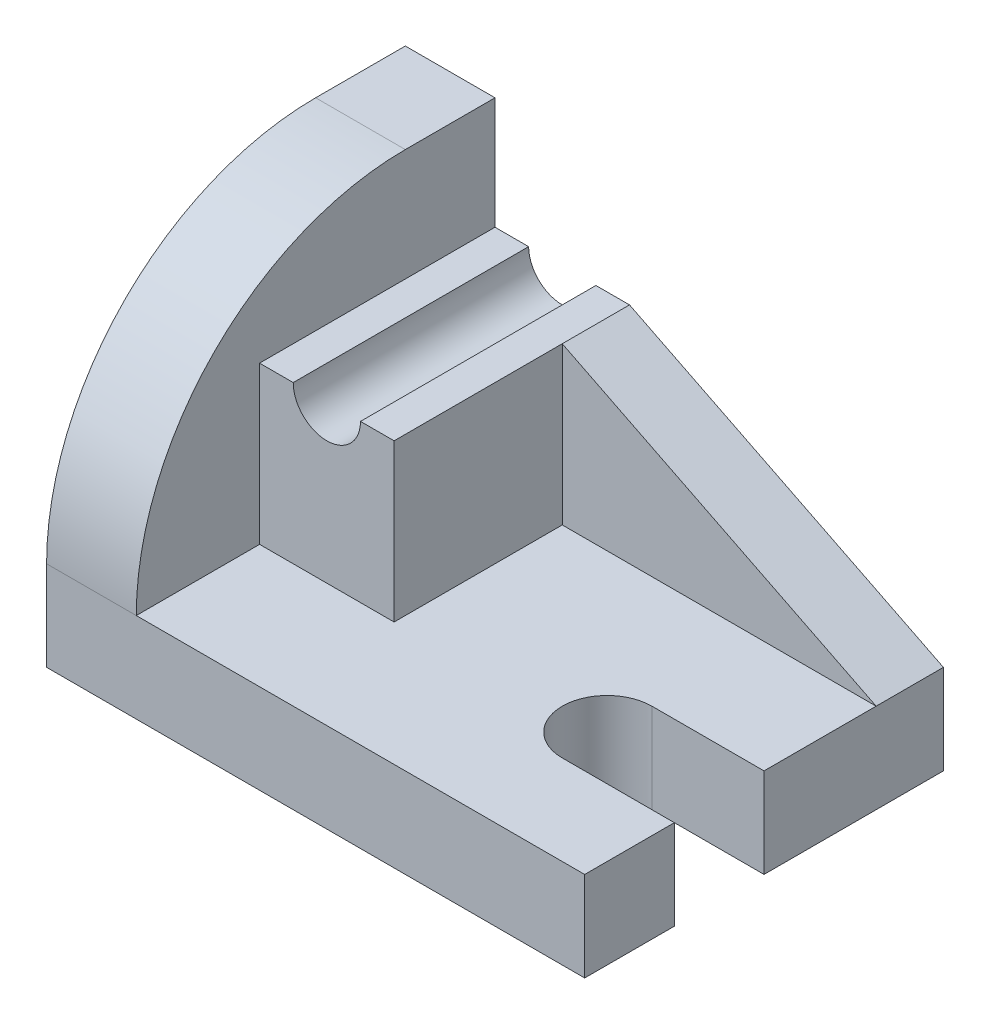
ISO-10303-21;
HEADER;
FILE_DESCRIPTION(('STEP AP214'),'2;1');
FILE_NAME('part.step','',(''),(''),'','','');
FILE_SCHEMA(('AUTOMOTIVE_DESIGN { 1 0 10303 214 1 1 1 1 }'));
ENDSEC;
DATA;
#1=APPLICATION_CONTEXT('core data for automotive mechanical design processes');
#2=APPLICATION_PROTOCOL_DEFINITION('international standard','automotive_design',2000,#1);
#3=PRODUCT_CONTEXT('',#1,'mechanical');
#4=PRODUCT('Part','Part','',(#3));
#5=PRODUCT_RELATED_PRODUCT_CATEGORY('part','',(#4));
#6=PRODUCT_DEFINITION_FORMATION('','',#4);
#7=PRODUCT_DEFINITION_CONTEXT('part definition',#1,'design');
#8=PRODUCT_DEFINITION('design','',#6,#7);
#9=PRODUCT_DEFINITION_SHAPE('','',#8);
#10=(LENGTH_UNIT() NAMED_UNIT(*) SI_UNIT(.MILLI.,.METRE.));
#11=(NAMED_UNIT(*) PLANE_ANGLE_UNIT() SI_UNIT($,.RADIAN.));
#12=(NAMED_UNIT(*) SI_UNIT($,.STERADIAN.) SOLID_ANGLE_UNIT());
#13=UNCERTAINTY_MEASURE_WITH_UNIT(LENGTH_MEASURE(1.E-05),#10,'distance_accuracy_value','');
#14=(GEOMETRIC_REPRESENTATION_CONTEXT(3) GLOBAL_UNCERTAINTY_ASSIGNED_CONTEXT((#13)) GLOBAL_UNIT_ASSIGNED_CONTEXT((#10,
#11,#12)) REPRESENTATION_CONTEXT('',''));
#15=CARTESIAN_POINT('',(0.,0.,0.));
#16=DIRECTION('',(0.,0.,1.));
#17=DIRECTION('',(1.,0.,0.));
#18=AXIS2_PLACEMENT_3D('',#15,#16,#17);
#19=CARTESIAN_POINT('',(0.,44.,0.));
#20=DIRECTION('',(0.,1.,0.));
#21=DIRECTION('',(0.,0.,1.));
#22=AXIS2_PLACEMENT_3D('',#19,#20,#21);
#23=PLANE('',#22);
#24=DIRECTION('',(0.,0.,-1.));
#25=VECTOR('',#24,1.);
#26=CARTESIAN_POINT('',(-14.,44.,10.));
#27=LINE('',#26,#25);
#28=CARTESIAN_POINT('',(-14.,44.,10.));
#29=VERTEX_POINT('',#28);
#30=CARTESIAN_POINT('',(-14.,44.,-32.));
#31=VERTEX_POINT('',#30);
#32=EDGE_CURVE('E11',#29,#31,#27,.T.);
#33=ORIENTED_EDGE('',*,*,#32,.F.);
#34=DIRECTION('',(1.,0.,0.));
#35=VECTOR('',#34,1.);
#36=CARTESIAN_POINT('',(-32.,44.,10.));
#37=LINE('',#36,#35);
#38=CARTESIAN_POINT('',(-7.99999999999999,44.,10.));
#39=VERTEX_POINT('',#38);
#40=EDGE_CURVE('E268',#29,#39,#37,.T.);
#41=ORIENTED_EDGE('',*,*,#40,.T.);
#42=DIRECTION('',(0.,0.,-1.));
#43=VECTOR('',#42,1.);
#44=CARTESIAN_POINT('',(-7.99999999999999,44.,-32.));
#45=LINE('',#44,#43);
#46=CARTESIAN_POINT('',(-7.99999999999999,44.,-20.));
#47=VERTEX_POINT('',#46);
#48=EDGE_CURVE('E174',#39,#47,#45,.T.);
#49=ORIENTED_EDGE('',*,*,#48,.T.);
#50=DIRECTION('',(0.,0.,-1.));
#51=VECTOR('',#50,1.);
#52=CARTESIAN_POINT('',(-7.99999999999999,44.,-20.));
#53=LINE('',#52,#51);
#54=CARTESIAN_POINT('',(-7.99999999999999,44.,-32.));
#55=VERTEX_POINT('',#54);
#56=EDGE_CURVE('E168',#47,#55,#53,.T.);
#57=ORIENTED_EDGE('',*,*,#56,.T.);
#58=DIRECTION('',(-1.,0.,0.));
#59=VECTOR('',#58,1.);
#60=CARTESIAN_POINT('',(-32.,44.,-32.));
#61=LINE('',#60,#59);
#62=EDGE_CURVE('E163',#55,#31,#61,.T.);
#63=ORIENTED_EDGE('',*,*,#62,.T.);
#64=EDGE_LOOP('',(#33,#41,#49,#57,#63));
#65=FACE_BOUND('',#64,.T.);
#66=ADVANCED_FACE('F39',(#65),#23,.T.);
#67=CARTESIAN_POINT('',(0.,16.,0.));
#68=DIRECTION('',(0.,-1.,0.));
#69=DIRECTION('',(0.,0.,-1.));
#70=AXIS2_PLACEMENT_3D('',#67,#68,#69);
#71=PLANE('',#70);
#72=DIRECTION('',(-1.,0.,0.));
#73=VECTOR('',#72,1.);
#74=CARTESIAN_POINT('',(-7.99999999999999,16.,-20.));
#75=LINE('',#74,#73);
#76=CARTESIAN_POINT('',(48.,16.,-20.));
#77=VERTEX_POINT('',#76);
#78=CARTESIAN_POINT('',(-7.99999999999999,16.,-20.));
#79=VERTEX_POINT('',#78);
#80=EDGE_CURVE('E279',#77,#79,#75,.T.);
#81=ORIENTED_EDGE('',*,*,#80,.T.);
#82=DIRECTION('',(0.,0.,-1.));
#83=VECTOR('',#82,1.);
#84=CARTESIAN_POINT('',(-7.99999999999999,16.,-32.));
#85=LINE('',#84,#83);
#86=CARTESIAN_POINT('',(-7.99999999999999,16.,10.));
#87=VERTEX_POINT('',#86);
#88=EDGE_CURVE('E180',#87,#79,#85,.T.);
#89=ORIENTED_EDGE('',*,*,#88,.F.);
#90=DIRECTION('',(1.,0.,0.));
#91=VECTOR('',#90,1.);
#92=CARTESIAN_POINT('',(-32.,16.,10.));
#93=LINE('',#92,#91);
#94=CARTESIAN_POINT('',(-32.,16.,10.));
#95=VERTEX_POINT('',#94);
#96=EDGE_CURVE('E178',#95,#87,#93,.T.);
#97=ORIENTED_EDGE('',*,*,#96,.F.);
#98=DIRECTION('',(0.,0.,-1.));
#99=VECTOR('',#98,1.);
#100=CARTESIAN_POINT('',(-32.,16.,0.));
#101=LINE('',#100,#99);
#102=CARTESIAN_POINT('',(-32.,16.,32.));
#103=VERTEX_POINT('',#102);
#104=EDGE_CURVE('E204',#103,#95,#101,.T.);
#105=ORIENTED_EDGE('',*,*,#104,.F.);
#106=DIRECTION('',(1.,0.,0.));
#107=VECTOR('',#106,1.);
#108=CARTESIAN_POINT('',(-48.,16.,32.));
#109=LINE('',#108,#107);
#110=CARTESIAN_POINT('',(48.,16.,32.));
#111=VERTEX_POINT('',#110);
#112=EDGE_CURVE('E238',#103,#111,#109,.T.);
#113=ORIENTED_EDGE('',*,*,#112,.T.);
#114=DIRECTION('',(0.,0.,-1.));
#115=VECTOR('',#114,1.);
#116=CARTESIAN_POINT('',(48.,16.,32.));
#117=LINE('',#116,#115);
#118=CARTESIAN_POINT('',(48.,16.,16.));
#119=VERTEX_POINT('',#118);
#120=EDGE_CURVE('E235',#111,#119,#117,.T.);
#121=ORIENTED_EDGE('',*,*,#120,.T.);
#122=DIRECTION('',(1.,0.,0.));
#123=VECTOR('',#122,1.);
#124=CARTESIAN_POINT('',(48.,16.,16.));
#125=LINE('',#124,#123);
#126=CARTESIAN_POINT('',(28.,16.,16.));
#127=VERTEX_POINT('',#126);
#128=EDGE_CURVE('E213',#127,#119,#125,.T.);
#129=ORIENTED_EDGE('',*,*,#128,.F.);
#130=CARTESIAN_POINT('',(28.,16.,8.));
#131=DIRECTION('',(0.,1.,0.));
#132=DIRECTION('',(0.,0.,1.));
#133=AXIS2_PLACEMENT_3D('',#130,#131,#132);
#134=CIRCLE('',#133,8.);
#135=CARTESIAN_POINT('',(28.,16.,0.));
#136=VERTEX_POINT('',#135);
#137=EDGE_CURVE('E222',#136,#127,#134,.T.);
#138=ORIENTED_EDGE('',*,*,#137,.F.);
#139=DIRECTION('',(-1.,0.,0.));
#140=VECTOR('',#139,1.);
#141=CARTESIAN_POINT('',(48.,16.,0.));
#142=LINE('',#141,#140);
#143=CARTESIAN_POINT('',(48.,16.,0.));
#144=VERTEX_POINT('',#143);
#145=EDGE_CURVE('E208',#144,#136,#142,.T.);
#146=ORIENTED_EDGE('',*,*,#145,.F.);
#147=EDGE_CURVE('E239',#144,#77,#117,.T.);
#148=ORIENTED_EDGE('',*,*,#147,.T.);
#149=EDGE_LOOP('',(#81,#89,#97,#105,#113,#121,#129,#138,#146,#148));
#150=FACE_BOUND('',#149,.T.);
#151=ADVANCED_FACE('F289',(#150),#71,.F.);
#152=CARTESIAN_POINT('',(-7.99999999999999,44.,-32.));
#153=DIRECTION('',(-1.,0.,0.));
#154=DIRECTION('',(0.,0.,1.));
#155=AXIS2_PLACEMENT_3D('',#152,#153,#154);
#156=PLANE('',#155);
#157=DIRECTION('',(0.,1.,0.));
#158=VECTOR('',#157,1.);
#159=CARTESIAN_POINT('',(-7.99999999999999,44.,-20.));
#160=LINE('',#159,#158);
#161=EDGE_CURVE('E282',#79,#47,#160,.T.);
#162=ORIENTED_EDGE('',*,*,#161,.T.);
#163=ORIENTED_EDGE('',*,*,#48,.F.);
#164=DIRECTION('',(0.,-1.,0.));
#165=VECTOR('',#164,1.);
#166=CARTESIAN_POINT('',(-7.99999999999999,44.,10.));
#167=LINE('',#166,#165);
#168=EDGE_CURVE('E169',#39,#87,#167,.T.);
#169=ORIENTED_EDGE('',*,*,#168,.T.);
#170=ORIENTED_EDGE('',*,*,#88,.T.);
#171=EDGE_LOOP('',(#162,#163,#169,#170));
#172=FACE_BOUND('',#171,.T.);
#173=ADVANCED_FACE('F296',(#172),#156,.F.);
#174=CARTESIAN_POINT('',(-32.,16.,-16.));
#175=DIRECTION('',(-1.,0.,0.));
#176=DIRECTION('',(0.,0.,1.));
#177=AXIS2_PLACEMENT_3D('',#174,#175,#176);
#178=PLANE('',#177);
#179=DIRECTION('',(0.,-1.,0.));
#180=VECTOR('',#179,1.);
#181=CARTESIAN_POINT('',(-32.,44.,10.));
#182=LINE('',#181,#180);
#183=CARTESIAN_POINT('',(-32.,44.,10.));
#184=VERTEX_POINT('',#183);
#185=EDGE_CURVE('E172',#184,#95,#182,.T.);
#186=ORIENTED_EDGE('',*,*,#185,.F.);
#187=DIRECTION('',(0.,0.,1.));
#188=VECTOR('',#187,1.);
#189=CARTESIAN_POINT('',(-32.,44.,-32.));
#190=LINE('',#189,#188);
#191=CARTESIAN_POINT('',(-32.,44.,-32.));
#192=VERTEX_POINT('',#191);
#193=EDGE_CURVE('E183',#192,#184,#190,.T.);
#194=ORIENTED_EDGE('',*,*,#193,.F.);
#195=DIRECTION('',(0.,-1.,0.));
#196=VECTOR('',#195,1.);
#197=CARTESIAN_POINT('',(-32.,0.,-32.));
#198=LINE('',#197,#196);
#199=CARTESIAN_POINT('',(-32.,64.,-32.));
#200=VERTEX_POINT('',#199);
#201=EDGE_CURVE('E194',#200,#192,#198,.T.);
#202=ORIENTED_EDGE('',*,*,#201,.F.);
#203=DIRECTION('',(0.,0.,-1.));
#204=VECTOR('',#203,1.);
#205=CARTESIAN_POINT('',(-32.,64.,-16.0000000000003));
#206=LINE('',#205,#204);
#207=CARTESIAN_POINT('',(-32.,64.,-16.0000000000003));
#208=VERTEX_POINT('',#207);
#209=EDGE_CURVE('E190',#208,#200,#206,.T.);
#210=ORIENTED_EDGE('',*,*,#209,.F.);
#211=CARTESIAN_POINT('',(-32.,16.,-16.));
#212=DIRECTION('',(-1.,0.,0.));
#213=DIRECTION('',(0.,0.,1.));
#214=AXIS2_PLACEMENT_3D('',#211,#212,#213);
#215=CIRCLE('',#214,48.);
#216=EDGE_CURVE('E187',#103,#208,#215,.T.);
#217=ORIENTED_EDGE('',*,*,#216,.F.);
#218=ORIENTED_EDGE('',*,*,#104,.T.);
#219=EDGE_LOOP('',(#186,#194,#202,#210,#217,#218));
#220=FACE_BOUND('',#219,.T.);
#221=ADVANCED_FACE('F301',(#220),#178,.F.);
#222=CARTESIAN_POINT('',(48.,16.,32.));
#223=DIRECTION('',(-1.,0.,0.));
#224=DIRECTION('',(0.,0.,1.));
#225=AXIS2_PLACEMENT_3D('',#222,#223,#224);
#226=PLANE('',#225);
#227=DIRECTION('',(0.,0.,-1.));
#228=VECTOR('',#227,1.);
#229=CARTESIAN_POINT('',(48.,0.,32.));
#230=LINE('',#229,#228);
#231=CARTESIAN_POINT('',(48.,0.,32.));
#232=VERTEX_POINT('',#231);
#233=CARTESIAN_POINT('',(48.,0.,16.));
#234=VERTEX_POINT('',#233);
#235=EDGE_CURVE('E244',#232,#234,#230,.T.);
#236=ORIENTED_EDGE('',*,*,#235,.T.);
#237=DIRECTION('',(0.,1.,0.));
#238=VECTOR('',#237,1.);
#239=CARTESIAN_POINT('',(48.,0.,16.));
#240=LINE('',#239,#238);
#241=EDGE_CURVE('E226',#234,#119,#240,.T.);
#242=ORIENTED_EDGE('',*,*,#241,.T.);
#243=ORIENTED_EDGE('',*,*,#120,.F.);
#244=DIRECTION('',(0.,-1.,0.));
#245=VECTOR('',#244,1.);
#246=CARTESIAN_POINT('',(48.,16.,32.));
#247=LINE('',#246,#245);
#248=EDGE_CURVE('E243',#111,#232,#247,.T.);
#249=ORIENTED_EDGE('',*,*,#248,.T.);
#250=EDGE_LOOP('',(#236,#242,#243,#249));
#251=FACE_BOUND('',#250,.T.);
#252=ADVANCED_FACE('F323',(#251),#226,.F.);
#253=ORIENTED_EDGE('',*,*,#147,.F.);
#254=DIRECTION('',(0.,1.,0.));
#255=VECTOR('',#254,1.);
#256=CARTESIAN_POINT('',(48.,0.,0.));
#257=LINE('',#256,#255);
#258=CARTESIAN_POINT('',(48.,0.,0.));
#259=VERTEX_POINT('',#258);
#260=EDGE_CURVE('E219',#259,#144,#257,.T.);
#261=ORIENTED_EDGE('',*,*,#260,.F.);
#262=CARTESIAN_POINT('',(48.,0.,-32.));
#263=VERTEX_POINT('',#262);
#264=EDGE_CURVE('E229',#259,#263,#230,.T.);
#265=ORIENTED_EDGE('',*,*,#264,.T.);
#266=DIRECTION('',(0.,-1.,0.));
#267=VECTOR('',#266,1.);
#268=CARTESIAN_POINT('',(48.,16.,-32.));
#269=LINE('',#268,#267);
#270=CARTESIAN_POINT('',(48.,16.,-32.));
#271=VERTEX_POINT('',#270);
#272=EDGE_CURVE('E261',#271,#263,#269,.T.);
#273=ORIENTED_EDGE('',*,*,#272,.F.);
#274=DIRECTION('',(0.,0.,-1.));
#275=VECTOR('',#274,1.);
#276=CARTESIAN_POINT('',(48.,16.,-20.));
#277=LINE('',#276,#275);
#278=EDGE_CURVE('E181',#77,#271,#277,.T.);
#279=ORIENTED_EDGE('',*,*,#278,.F.);
#280=EDGE_LOOP('',(#253,#261,#265,#273,#279));
#281=FACE_BOUND('',#280,.T.);
#282=ADVANCED_FACE('F41',(#281),#226,.F.);
#283=CARTESIAN_POINT('',(-48.,16.,-32.));
#284=DIRECTION('',(0.,0.,1.));
#285=DIRECTION('',(1.,0.,0.));
#286=AXIS2_PLACEMENT_3D('',#283,#284,#285);
#287=PLANE('',#286);
#288=CARTESIAN_POINT('',(-26.,44.,-32.));
#289=VERTEX_POINT('',#288);
#290=EDGE_CURVE('E60',#289,#192,#61,.T.);
#291=ORIENTED_EDGE('',*,*,#290,.F.);
#292=CARTESIAN_POINT('',(-20.,44.,-32.));
#293=DIRECTION('',(0.,0.,-1.));
#294=DIRECTION('',(-1.,0.,0.));
#295=AXIS2_PLACEMENT_3D('',#292,#293,#294);
#296=CIRCLE('',#295,6.);
#297=EDGE_CURVE('E53',#31,#289,#296,.T.);
#298=ORIENTED_EDGE('',*,*,#297,.F.);
#299=ORIENTED_EDGE('',*,*,#62,.F.);
#300=DIRECTION('',(0.894427190999916,-0.447213595499958,0.));
#301=VECTOR('',#300,1.);
#302=CARTESIAN_POINT('',(48.,16.,-32.));
#303=LINE('',#302,#301);
#304=EDGE_CURVE('E269',#55,#271,#303,.T.);
#305=ORIENTED_EDGE('',*,*,#304,.T.);
#306=ORIENTED_EDGE('',*,*,#272,.T.);
#307=DIRECTION('',(-1.,0.,0.));
#308=VECTOR('',#307,1.);
#309=CARTESIAN_POINT('',(-48.,0.,-32.));
#310=LINE('',#309,#308);
#311=CARTESIAN_POINT('',(-48.,0.,-32.));
#312=VERTEX_POINT('',#311);
#313=EDGE_CURVE('E247',#263,#312,#310,.T.);
#314=ORIENTED_EDGE('',*,*,#313,.T.);
#315=DIRECTION('',(0.,-1.,0.));
#316=VECTOR('',#315,1.);
#317=CARTESIAN_POINT('',(-48.,16.,-32.));
#318=LINE('',#317,#316);
#319=CARTESIAN_POINT('',(-48.,64.,-32.));
#320=VERTEX_POINT('',#319);
#321=EDGE_CURVE('E258',#320,#312,#318,.T.);
#322=ORIENTED_EDGE('',*,*,#321,.F.);
#323=DIRECTION('',(-1.,0.,0.));
#324=VECTOR('',#323,1.);
#325=CARTESIAN_POINT('',(-32.,64.,-32.));
#326=LINE('',#325,#324);
#327=EDGE_CURVE('E201',#200,#320,#326,.T.);
#328=ORIENTED_EDGE('',*,*,#327,.F.);
#329=ORIENTED_EDGE('',*,*,#201,.T.);
#330=EDGE_LOOP('',(#291,#298,#299,#305,#306,#314,#322,#328,#329));
#331=FACE_BOUND('',#330,.T.);
#332=ADVANCED_FACE('F161',(#331),#287,.F.);
#333=CARTESIAN_POINT('',(-48.,16.,32.));
#334=DIRECTION('',(1.,0.,0.));
#335=DIRECTION('',(0.,0.,-1.));
#336=AXIS2_PLACEMENT_3D('',#333,#334,#335);
#337=PLANE('',#336);
#338=DIRECTION('',(0.,0.,1.));
#339=VECTOR('',#338,1.);
#340=CARTESIAN_POINT('',(-48.,0.,32.));
#341=LINE('',#340,#339);
#342=CARTESIAN_POINT('',(-48.,0.,32.));
#343=VERTEX_POINT('',#342);
#344=EDGE_CURVE('E249',#312,#343,#341,.T.);
#345=ORIENTED_EDGE('',*,*,#344,.T.);
#346=DIRECTION('',(0.,-1.,0.));
#347=VECTOR('',#346,1.);
#348=CARTESIAN_POINT('',(-48.,16.,32.));
#349=LINE('',#348,#347);
#350=CARTESIAN_POINT('',(-48.,15.9999999999997,32.));
#351=VERTEX_POINT('',#350);
#352=EDGE_CURVE('E255',#351,#343,#349,.T.);
#353=ORIENTED_EDGE('',*,*,#352,.F.);
#354=CARTESIAN_POINT('',(-48.,16.,-16.));
#355=DIRECTION('',(-1.,0.,0.));
#356=DIRECTION('',(0.,0.,1.));
#357=AXIS2_PLACEMENT_3D('',#354,#355,#356);
#358=CIRCLE('',#357,48.);
#359=CARTESIAN_POINT('',(-48.,64.,-16.0000000000003));
#360=VERTEX_POINT('',#359);
#361=EDGE_CURVE('E186',#351,#360,#358,.T.);
#362=ORIENTED_EDGE('',*,*,#361,.T.);
#363=DIRECTION('',(0.,0.,-1.));
#364=VECTOR('',#363,1.);
#365=CARTESIAN_POINT('',(-48.,64.,-16.0000000000003));
#366=LINE('',#365,#364);
#367=EDGE_CURVE('E191',#360,#320,#366,.T.);
#368=ORIENTED_EDGE('',*,*,#367,.T.);
#369=ORIENTED_EDGE('',*,*,#321,.T.);
#370=EDGE_LOOP('',(#345,#353,#362,#368,#369));
#371=FACE_BOUND('',#370,.T.);
#372=ADVANCED_FACE('F314',(#371),#337,.F.);
#373=CARTESIAN_POINT('',(-48.,16.,32.));
#374=DIRECTION('',(0.,0.,-1.));
#375=DIRECTION('',(-1.,0.,0.));
#376=AXIS2_PLACEMENT_3D('',#373,#374,#375);
#377=PLANE('',#376);
#378=DIRECTION('',(1.,0.,0.));
#379=VECTOR('',#378,1.);
#380=CARTESIAN_POINT('',(-48.,0.,32.));
#381=LINE('',#380,#379);
#382=EDGE_CURVE('E251',#343,#232,#381,.T.);
#383=ORIENTED_EDGE('',*,*,#382,.T.);
#384=ORIENTED_EDGE('',*,*,#248,.F.);
#385=ORIENTED_EDGE('',*,*,#112,.F.);
#386=EDGE_CURVE('E240',#351,#103,#109,.T.);
#387=ORIENTED_EDGE('',*,*,#386,.F.);
#388=ORIENTED_EDGE('',*,*,#352,.T.);
#389=EDGE_LOOP('',(#383,#384,#385,#387,#388));
#390=FACE_BOUND('',#389,.T.);
#391=ADVANCED_FACE('F310',(#390),#377,.F.);
#392=CARTESIAN_POINT('',(0.,0.,0.));
#393=DIRECTION('',(0.,-1.,0.));
#394=DIRECTION('',(0.,0.,-1.));
#395=AXIS2_PLACEMENT_3D('',#392,#393,#394);
#396=PLANE('',#395);
#397=ORIENTED_EDGE('',*,*,#344,.F.);
#398=ORIENTED_EDGE('',*,*,#313,.F.);
#399=ORIENTED_EDGE('',*,*,#264,.F.);
#400=DIRECTION('',(-1.,0.,0.));
#401=VECTOR('',#400,1.);
#402=CARTESIAN_POINT('',(48.,0.,0.));
#403=LINE('',#402,#401);
#404=CARTESIAN_POINT('',(28.,0.,0.));
#405=VERTEX_POINT('',#404);
#406=EDGE_CURVE('E209',#259,#405,#403,.T.);
#407=ORIENTED_EDGE('',*,*,#406,.T.);
#408=CARTESIAN_POINT('',(28.,0.,8.));
#409=DIRECTION('',(0.,1.,0.));
#410=DIRECTION('',(0.,0.,1.));
#411=AXIS2_PLACEMENT_3D('',#408,#409,#410);
#412=CIRCLE('',#411,8.);
#413=CARTESIAN_POINT('',(28.,0.,16.));
#414=VERTEX_POINT('',#413);
#415=EDGE_CURVE('E212',#405,#414,#412,.T.);
#416=ORIENTED_EDGE('',*,*,#415,.T.);
#417=DIRECTION('',(1.,0.,0.));
#418=VECTOR('',#417,1.);
#419=CARTESIAN_POINT('',(48.,0.,16.));
#420=LINE('',#419,#418);
#421=EDGE_CURVE('E216',#414,#234,#420,.T.);
#422=ORIENTED_EDGE('',*,*,#421,.T.);
#423=ORIENTED_EDGE('',*,*,#235,.F.);
#424=ORIENTED_EDGE('',*,*,#382,.F.);
#425=EDGE_LOOP('',(#397,#398,#399,#407,#416,#422,#423,#424));
#426=FACE_BOUND('',#425,.T.);
#427=ADVANCED_FACE('F318',(#426),#396,.T.);
#428=CARTESIAN_POINT('',(48.,0.,16.));
#429=DIRECTION('',(0.,0.,1.));
#430=DIRECTION('',(1.,0.,0.));
#431=AXIS2_PLACEMENT_3D('',#428,#429,#430);
#432=PLANE('',#431);
#433=ORIENTED_EDGE('',*,*,#128,.T.);
#434=ORIENTED_EDGE('',*,*,#241,.F.);
#435=ORIENTED_EDGE('',*,*,#421,.F.);
#436=DIRECTION('',(0.,1.,0.));
#437=VECTOR('',#436,1.);
#438=CARTESIAN_POINT('',(28.,0.,16.));
#439=LINE('',#438,#437);
#440=EDGE_CURVE('E230',#414,#127,#439,.T.);
#441=ORIENTED_EDGE('',*,*,#440,.T.);
#442=EDGE_LOOP('',(#433,#434,#435,#441));
#443=FACE_BOUND('',#442,.T.);
#444=ADVANCED_FACE('F327',(#443),#432,.F.);
#445=CARTESIAN_POINT('',(28.,0.,8.));
#446=DIRECTION('',(0.,1.,0.));
#447=DIRECTION('',(0.,0.,1.));
#448=AXIS2_PLACEMENT_3D('',#445,#446,#447);
#449=CYLINDRICAL_SURFACE('',#448,8.);
#450=ORIENTED_EDGE('',*,*,#137,.T.);
#451=ORIENTED_EDGE('',*,*,#440,.F.);
#452=ORIENTED_EDGE('',*,*,#415,.F.);
#453=DIRECTION('',(0.,1.,0.));
#454=VECTOR('',#453,1.);
#455=CARTESIAN_POINT('',(28.,0.,0.));
#456=LINE('',#455,#454);
#457=EDGE_CURVE('E232',#405,#136,#456,.T.);
#458=ORIENTED_EDGE('',*,*,#457,.T.);
#459=EDGE_LOOP('',(#450,#451,#452,#458));
#460=FACE_BOUND('',#459,.T.);
#461=ADVANCED_FACE('F330',(#460),#449,.F.);
#462=CARTESIAN_POINT('',(48.,0.,0.));
#463=DIRECTION('',(0.,0.,-1.));
#464=DIRECTION('',(-1.,0.,0.));
#465=AXIS2_PLACEMENT_3D('',#462,#463,#464);
#466=PLANE('',#465);
#467=ORIENTED_EDGE('',*,*,#145,.T.);
#468=ORIENTED_EDGE('',*,*,#457,.F.);
#469=ORIENTED_EDGE('',*,*,#406,.F.);
#470=ORIENTED_EDGE('',*,*,#260,.T.);
#471=EDGE_LOOP('',(#467,#468,#469,#470));
#472=FACE_BOUND('',#471,.T.);
#473=ADVANCED_FACE('F333',(#472),#466,.F.);
#474=CARTESIAN_POINT('',(-32.,64.,-16.0000000000003));
#475=DIRECTION('',(0.,1.,0.));
#476=DIRECTION('',(0.,0.,1.));
#477=AXIS2_PLACEMENT_3D('',#474,#475,#476);
#478=PLANE('',#477);
#479=ORIENTED_EDGE('',*,*,#367,.F.);
#480=DIRECTION('',(-1.,0.,0.));
#481=VECTOR('',#480,1.);
#482=CARTESIAN_POINT('',(-32.,64.,-16.0000000000003));
#483=LINE('',#482,#481);
#484=EDGE_CURVE('E196',#208,#360,#483,.T.);
#485=ORIENTED_EDGE('',*,*,#484,.F.);
#486=ORIENTED_EDGE('',*,*,#209,.T.);
#487=ORIENTED_EDGE('',*,*,#327,.T.);
#488=EDGE_LOOP('',(#479,#485,#486,#487));
#489=FACE_BOUND('',#488,.T.);
#490=ADVANCED_FACE('F341',(#489),#478,.T.);
#491=CARTESIAN_POINT('',(-32.,16.,-16.));
#492=DIRECTION('',(-1.,0.,0.));
#493=DIRECTION('',(0.,0.,1.));
#494=AXIS2_PLACEMENT_3D('',#491,#492,#493);
#495=CYLINDRICAL_SURFACE('',#494,48.);
#496=ORIENTED_EDGE('',*,*,#361,.F.);
#497=ORIENTED_EDGE('',*,*,#386,.T.);
#498=ORIENTED_EDGE('',*,*,#216,.T.);
#499=ORIENTED_EDGE('',*,*,#484,.T.);
#500=EDGE_LOOP('',(#496,#497,#498,#499));
#501=FACE_BOUND('',#500,.T.);
#502=ADVANCED_FACE('F306',(#501),#495,.T.);
#503=CARTESIAN_POINT('',(-32.,44.,10.));
#504=DIRECTION('',(0.,0.,-1.));
#505=DIRECTION('',(-1.,0.,0.));
#506=AXIS2_PLACEMENT_3D('',#503,#504,#505);
#507=PLANE('',#506);
#508=ORIENTED_EDGE('',*,*,#40,.F.);
#509=CARTESIAN_POINT('',(-20.,44.,10.));
#510=DIRECTION('',(0.,0.,-1.));
#511=DIRECTION('',(-1.,0.,0.));
#512=AXIS2_PLACEMENT_3D('',#509,#510,#511);
#513=CIRCLE('',#512,6.);
#514=CARTESIAN_POINT('',(-26.,44.,10.));
#515=VERTEX_POINT('',#514);
#516=EDGE_CURVE('E155',#29,#515,#513,.T.);
#517=ORIENTED_EDGE('',*,*,#516,.T.);
#518=EDGE_CURVE('E266',#184,#515,#37,.T.);
#519=ORIENTED_EDGE('',*,*,#518,.F.);
#520=ORIENTED_EDGE('',*,*,#185,.T.);
#521=ORIENTED_EDGE('',*,*,#96,.T.);
#522=ORIENTED_EDGE('',*,*,#168,.F.);
#523=EDGE_LOOP('',(#508,#517,#519,#520,#521,#522));
#524=FACE_BOUND('',#523,.T.);
#525=ADVANCED_FACE('F265',(#524),#507,.F.);
#526=DIRECTION('',(0.,0.,-1.));
#527=VECTOR('',#526,1.);
#528=CARTESIAN_POINT('',(-26.,44.,10.));
#529=LINE('',#528,#527);
#530=EDGE_CURVE('E47',#289,#515,#529,.F.);
#531=ORIENTED_EDGE('',*,*,#530,.F.);
#532=ORIENTED_EDGE('',*,*,#290,.T.);
#533=ORIENTED_EDGE('',*,*,#193,.T.);
#534=ORIENTED_EDGE('',*,*,#518,.T.);
#535=EDGE_LOOP('',(#531,#532,#533,#534));
#536=FACE_BOUND('',#535,.T.);
#537=ADVANCED_FACE('F271',(#536),#23,.T.);
#538=CARTESIAN_POINT('',(48.,16.,-20.));
#539=DIRECTION('',(0.447213595499958,0.894427190999916,0.));
#540=DIRECTION('',(-0.894427190999916,0.447213595499958,0.));
#541=AXIS2_PLACEMENT_3D('',#538,#539,#540);
#542=PLANE('',#541);
#543=ORIENTED_EDGE('',*,*,#304,.F.);
#544=ORIENTED_EDGE('',*,*,#56,.F.);
#545=DIRECTION('',(0.894427190999916,-0.447213595499958,0.));
#546=VECTOR('',#545,1.);
#547=CARTESIAN_POINT('',(48.,16.,-20.));
#548=LINE('',#547,#546);
#549=EDGE_CURVE('E276',#47,#77,#548,.T.);
#550=ORIENTED_EDGE('',*,*,#549,.T.);
#551=ORIENTED_EDGE('',*,*,#278,.T.);
#552=EDGE_LOOP('',(#543,#544,#550,#551));
#553=FACE_BOUND('',#552,.T.);
#554=ADVANCED_FACE('F339',(#553),#542,.T.);
#555=CARTESIAN_POINT('',(0.,0.,-20.));
#556=DIRECTION('',(0.,0.,-1.));
#557=DIRECTION('',(-1.,0.,0.));
#558=AXIS2_PLACEMENT_3D('',#555,#556,#557);
#559=PLANE('',#558);
#560=ORIENTED_EDGE('',*,*,#80,.F.);
#561=ORIENTED_EDGE('',*,*,#549,.F.);
#562=ORIENTED_EDGE('',*,*,#161,.F.);
#563=EDGE_LOOP('',(#560,#561,#562));
#564=FACE_BOUND('',#563,.T.);
#565=ADVANCED_FACE('F368',(#564),#559,.F.);
#566=CARTESIAN_POINT('',(-20.,44.,10.));
#567=DIRECTION('',(0.,0.,-1.));
#568=DIRECTION('',(-1.,0.,0.));
#569=AXIS2_PLACEMENT_3D('',#566,#567,#568);
#570=CYLINDRICAL_SURFACE('',#569,6.);
#571=ORIENTED_EDGE('',*,*,#32,.T.);
#572=ORIENTED_EDGE('',*,*,#297,.T.);
#573=ORIENTED_EDGE('',*,*,#530,.T.);
#574=ORIENTED_EDGE('',*,*,#516,.F.);
#575=EDGE_LOOP('',(#571,#572,#573,#574));
#576=FACE_BOUND('',#575,.T.);
#577=ADVANCED_FACE('F153',(#576),#570,.F.);
#578=CLOSED_SHELL('',(#66,#151,#173,#221,#252,#282,#332,#372,#391,#427,#444,#461,#473,#490,#502,
#525,#537,#554,#565,#577));
#579=MANIFOLD_SOLID_BREP('B2',#578);
#580=ADVANCED_BREP_SHAPE_REPRESENTATION('',(#18,#579),#14);
#581=SHAPE_DEFINITION_REPRESENTATION(#9,#580);
ENDSEC;
END-ISO-10303-21;
